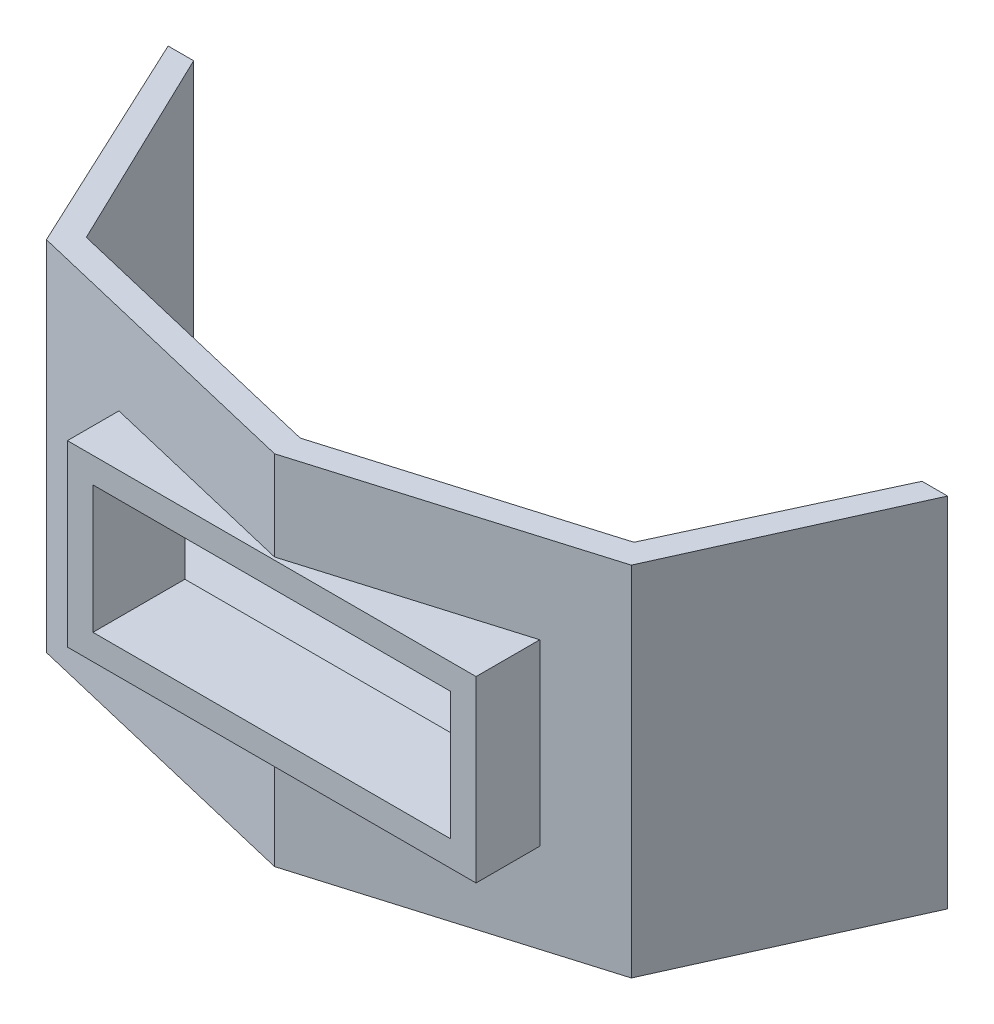
ISO-10303-21;
HEADER;
FILE_DESCRIPTION(('STEP AP214'),'2;1');
FILE_NAME('part.step','',(''),(''),'','','');
FILE_SCHEMA(('AUTOMOTIVE_DESIGN { 1 0 10303 214 1 1 1 1 }'));
ENDSEC;
DATA;
#1=APPLICATION_CONTEXT('core data for automotive mechanical design processes');
#2=APPLICATION_PROTOCOL_DEFINITION('international standard','automotive_design',2000,#1);
#3=PRODUCT_CONTEXT('',#1,'mechanical');
#4=PRODUCT('Part','Part','',(#3));
#5=PRODUCT_RELATED_PRODUCT_CATEGORY('part','',(#4));
#6=PRODUCT_DEFINITION_FORMATION('','',#4);
#7=PRODUCT_DEFINITION_CONTEXT('part definition',#1,'design');
#8=PRODUCT_DEFINITION('design','',#6,#7);
#9=PRODUCT_DEFINITION_SHAPE('','',#8);
#10=(LENGTH_UNIT() NAMED_UNIT(*) SI_UNIT(.MILLI.,.METRE.));
#11=(NAMED_UNIT(*) PLANE_ANGLE_UNIT() SI_UNIT($,.RADIAN.));
#12=(NAMED_UNIT(*) SI_UNIT($,.STERADIAN.) SOLID_ANGLE_UNIT());
#13=UNCERTAINTY_MEASURE_WITH_UNIT(LENGTH_MEASURE(1.E-05),#10,'distance_accuracy_value','');
#14=(GEOMETRIC_REPRESENTATION_CONTEXT(3) GLOBAL_UNCERTAINTY_ASSIGNED_CONTEXT((#13)) GLOBAL_UNIT_ASSIGNED_CONTEXT((#10,
#11,#12)) REPRESENTATION_CONTEXT('',''));
#15=CARTESIAN_POINT('',(0.,0.,0.));
#16=DIRECTION('',(0.,0.,1.));
#17=DIRECTION('',(1.,0.,0.));
#18=AXIS2_PLACEMENT_3D('',#15,#16,#17);
#19=CARTESIAN_POINT('',(-76.3,70.,57.7350269189626));
#20=DIRECTION('',(0.,0.,1.));
#21=DIRECTION('',(1.,0.,0.));
#22=AXIS2_PLACEMENT_3D('',#19,#20,#21);
#23=PLANE('',#22);
#24=DIRECTION('',(-1.,0.,0.));
#25=VECTOR('',#24,1.);
#26=CARTESIAN_POINT('',(-76.3,70.,57.7350269189626));
#27=LINE('',#26,#25);
#28=CARTESIAN_POINT('',(-71.3,70.,57.7350269189626));
#29=VERTEX_POINT('',#28);
#30=CARTESIAN_POINT('',(-76.3,70.,57.7350269189626));
#31=VERTEX_POINT('',#30);
#32=EDGE_CURVE('E340',#29,#31,#27,.T.);
#33=ORIENTED_EDGE('',*,*,#32,.F.);
#34=DIRECTION('',(0.,1.,0.));
#35=VECTOR('',#34,1.);
#36=CARTESIAN_POINT('',(-71.3,5.,57.7350269189626));
#37=LINE('',#36,#35);
#38=CARTESIAN_POINT('',(-71.3,5.,57.7350269189626));
#39=VERTEX_POINT('',#38);
#40=EDGE_CURVE('E322',#39,#29,#37,.T.);
#41=ORIENTED_EDGE('',*,*,#40,.F.);
#42=DIRECTION('',(-1.,0.,0.));
#43=VECTOR('',#42,1.);
#44=CARTESIAN_POINT('',(-71.3,5.,57.7350269189626));
#45=LINE('',#44,#43);
#46=CARTESIAN_POINT('',(71.3,5.,57.7350269189626));
#47=VERTEX_POINT('',#46);
#48=EDGE_CURVE('E310',#47,#39,#45,.T.);
#49=ORIENTED_EDGE('',*,*,#48,.F.);
#50=DIRECTION('',(0.,1.,0.));
#51=VECTOR('',#50,1.);
#52=CARTESIAN_POINT('',(71.3,5.,57.7350269189626));
#53=LINE('',#52,#51);
#54=CARTESIAN_POINT('',(71.3,70.,57.7350269189626));
#55=VERTEX_POINT('',#54);
#56=EDGE_CURVE('E325',#47,#55,#53,.T.);
#57=ORIENTED_EDGE('',*,*,#56,.T.);
#58=CARTESIAN_POINT('',(76.3,70.,57.7350269189626));
#59=VERTEX_POINT('',#58);
#60=EDGE_CURVE('E336',#59,#55,#27,.T.);
#61=ORIENTED_EDGE('',*,*,#60,.F.);
#62=DIRECTION('',(0.,-1.,0.));
#63=VECTOR('',#62,1.);
#64=CARTESIAN_POINT('',(76.3,70.,57.7350269189626));
#65=LINE('',#64,#63);
#66=CARTESIAN_POINT('',(76.3,0.,57.7350269189626));
#67=VERTEX_POINT('',#66);
#68=EDGE_CURVE('E348',#59,#67,#65,.T.);
#69=ORIENTED_EDGE('',*,*,#68,.T.);
#70=DIRECTION('',(-1.,0.,0.));
#71=VECTOR('',#70,1.);
#72=CARTESIAN_POINT('',(-76.3,0.,57.7350269189626));
#73=LINE('',#72,#71);
#74=CARTESIAN_POINT('',(-76.3,0.,57.7350269189626));
#75=VERTEX_POINT('',#74);
#76=EDGE_CURVE('E324',#67,#75,#73,.T.);
#77=ORIENTED_EDGE('',*,*,#76,.T.);
#78=DIRECTION('',(0.,-1.,0.));
#79=VECTOR('',#78,1.);
#80=CARTESIAN_POINT('',(-76.3,70.,57.7350269189626));
#81=LINE('',#80,#79);
#82=EDGE_CURVE('E372',#31,#75,#81,.T.);
#83=ORIENTED_EDGE('',*,*,#82,.F.);
#84=EDGE_LOOP('',(#33,#41,#49,#57,#61,#69,#77,#83));
#85=FACE_BOUND('',#84,.T.);
#86=ADVANCED_FACE('F37',(#85),#23,.F.);
#87=CARTESIAN_POINT('',(-55.3740303304235,70.,102.482648944706));
#88=DIRECTION('',(0.905843488046065,0.,-0.423612529517882));
#89=DIRECTION('',(-0.423612529517882,0.,-0.905843488046065));
#90=AXIS2_PLACEMENT_3D('',#87,#88,#89);
#91=PLANE('',#90);
#92=DIRECTION('',(0.423612529517882,0.,0.905843488046065));
#93=VECTOR('',#92,1.);
#94=CARTESIAN_POINT('',(-55.3740303304235,0.,102.482648944706));
#95=LINE('',#94,#93);
#96=CARTESIAN_POINT('',(-55.3740303304235,0.,102.482648944706));
#97=VERTEX_POINT('',#96);
#98=EDGE_CURVE('E351',#75,#97,#95,.T.);
#99=ORIENTED_EDGE('',*,*,#98,.T.);
#100=DIRECTION('',(0.,-1.,0.));
#101=VECTOR('',#100,1.);
#102=CARTESIAN_POINT('',(-55.3740303304235,70.,102.482648944706));
#103=LINE('',#102,#101);
#104=CARTESIAN_POINT('',(-55.3740303304235,70.,102.482648944706));
#105=VERTEX_POINT('',#104);
#106=EDGE_CURVE('E369',#105,#97,#103,.T.);
#107=ORIENTED_EDGE('',*,*,#106,.F.);
#108=DIRECTION('',(0.423612529517882,0.,0.905843488046065));
#109=VECTOR('',#108,1.);
#110=CARTESIAN_POINT('',(-55.3740303304235,70.,102.482648944706));
#111=LINE('',#110,#109);
#112=EDGE_CURVE('E339',#31,#105,#111,.T.);
#113=ORIENTED_EDGE('',*,*,#112,.F.);
#114=ORIENTED_EDGE('',*,*,#82,.T.);
#115=EDGE_LOOP('',(#99,#107,#113,#114));
#116=FACE_BOUND('',#115,.T.);
#117=ADVANCED_FACE('F425',(#116),#91,.F.);
#118=CARTESIAN_POINT('',(-55.3740303304235,70.,102.482648944706));
#119=DIRECTION('',(0.231748268351548,0.,-0.972775791288033));
#120=DIRECTION('',(-0.972775791288033,0.,-0.231748268351548));
#121=AXIS2_PLACEMENT_3D('',#118,#119,#120);
#122=PLANE('',#121);
#123=DIRECTION('',(0.,-1.,0.));
#124=VECTOR('',#123,1.);
#125=CARTESIAN_POINT('',(3.25268607798043,70.,116.449526131067));
#126=LINE('',#125,#124);
#127=CARTESIAN_POINT('',(3.25268607798043,17.5,116.449526131067));
#128=VERTEX_POINT('',#127);
#129=CARTESIAN_POINT('',(3.25268607798043,0.,116.449526131067));
#130=VERTEX_POINT('',#129);
#131=EDGE_CURVE('E365',#128,#130,#126,.T.);
#132=ORIENTED_EDGE('',*,*,#131,.F.);
#133=DIRECTION('',(-0.972775791288033,0.,-0.231748268351548));
#134=VECTOR('',#133,1.);
#135=CARTESIAN_POINT('',(-55.3740303304235,17.5,102.482648944706));
#136=LINE('',#135,#134);
#137=CARTESIAN_POINT('',(-36.7473139220196,17.5,106.920166110925));
#138=VERTEX_POINT('',#137);
#139=EDGE_CURVE('E290',#128,#138,#136,.T.);
#140=ORIENTED_EDGE('',*,*,#139,.T.);
#141=DIRECTION('',(0.,1.,0.));
#142=VECTOR('',#141,1.);
#143=CARTESIAN_POINT('',(-36.7473139220196,70.,106.920166110925));
#144=LINE('',#143,#142);
#145=CARTESIAN_POINT('',(-36.7473139220196,52.5,106.920166110925));
#146=VERTEX_POINT('',#145);
#147=EDGE_CURVE('E281',#138,#146,#144,.T.);
#148=ORIENTED_EDGE('',*,*,#147,.T.);
#149=DIRECTION('',(0.972775791288033,0.,0.231748268351548));
#150=VECTOR('',#149,1.);
#151=CARTESIAN_POINT('',(-55.3740303304235,52.5,102.482648944706));
#152=LINE('',#151,#150);
#153=CARTESIAN_POINT('',(3.25268607798043,52.5,116.449526131067));
#154=VERTEX_POINT('',#153);
#155=EDGE_CURVE('E278',#146,#154,#152,.T.);
#156=ORIENTED_EDGE('',*,*,#155,.T.);
#157=CARTESIAN_POINT('',(3.25268607798043,70.,116.449526131067));
#158=VERTEX_POINT('',#157);
#159=EDGE_CURVE('E366',#158,#154,#126,.T.);
#160=ORIENTED_EDGE('',*,*,#159,.F.);
#161=DIRECTION('',(0.972775791288033,0.,0.231748268351548));
#162=VECTOR('',#161,1.);
#163=CARTESIAN_POINT('',(-55.3740303304235,70.,102.482648944706));
#164=LINE('',#163,#162);
#165=EDGE_CURVE('E342',#105,#158,#164,.T.);
#166=ORIENTED_EDGE('',*,*,#165,.F.);
#167=ORIENTED_EDGE('',*,*,#106,.T.);
#168=DIRECTION('',(0.972775791288033,0.,0.231748268351548));
#169=VECTOR('',#168,1.);
#170=CARTESIAN_POINT('',(-55.3740303304235,0.,102.482648944706));
#171=LINE('',#170,#169);
#172=EDGE_CURVE('E353',#97,#130,#171,.T.);
#173=ORIENTED_EDGE('',*,*,#172,.T.);
#174=EDGE_LOOP('',(#132,#140,#148,#156,#160,#166,#167,#173));
#175=FACE_BOUND('',#174,.T.);
#176=ADVANCED_FACE('F430',(#175),#122,.F.);
#177=CARTESIAN_POINT('',(3.25268607798043,70.,116.449526131067));
#178=DIRECTION('',(-0.285688007968523,0.,-0.95832268161772));
#179=DIRECTION('',(-0.95832268161772,0.,0.285688007968523));
#180=AXIS2_PLACEMENT_3D('',#177,#178,#179);
#181=PLANE('',#180);
#182=DIRECTION('',(0.,-1.,0.));
#183=VECTOR('',#182,1.);
#184=CARTESIAN_POINT('',(43.2526860779804,70.,104.525024563964));
#185=LINE('',#184,#183);
#186=CARTESIAN_POINT('',(43.2526860779804,52.5,104.525024563964));
#187=VERTEX_POINT('',#186);
#188=CARTESIAN_POINT('',(43.2526860779805,17.5,104.525024563964));
#189=VERTEX_POINT('',#188);
#190=EDGE_CURVE('E293',#187,#189,#185,.T.);
#191=ORIENTED_EDGE('',*,*,#190,.T.);
#192=DIRECTION('',(-0.95832268161772,0.,0.285688007968523));
#193=VECTOR('',#192,1.);
#194=CARTESIAN_POINT('',(3.25268607798043,17.5,116.449526131067));
#195=LINE('',#194,#193);
#196=EDGE_CURVE('E287',#189,#128,#195,.T.);
#197=ORIENTED_EDGE('',*,*,#196,.T.);
#198=ORIENTED_EDGE('',*,*,#131,.T.);
#199=DIRECTION('',(0.958322681617719,0.,-0.285688007968523));
#200=VECTOR('',#199,1.);
#201=CARTESIAN_POINT('',(3.25268607798043,0.,116.449526131067));
#202=LINE('',#201,#200);
#203=CARTESIAN_POINT('',(57.0602122971787,0.,100.408827862998));
#204=VERTEX_POINT('',#203);
#205=EDGE_CURVE('E356',#130,#204,#202,.T.);
#206=ORIENTED_EDGE('',*,*,#205,.T.);
#207=DIRECTION('',(0.,-1.,0.));
#208=VECTOR('',#207,1.);
#209=CARTESIAN_POINT('',(57.0602122971787,70.,100.408827862998));
#210=LINE('',#209,#208);
#211=CARTESIAN_POINT('',(57.0602122971787,70.,100.408827862998));
#212=VERTEX_POINT('',#211);
#213=EDGE_CURVE('E362',#212,#204,#210,.T.);
#214=ORIENTED_EDGE('',*,*,#213,.F.);
#215=DIRECTION('',(0.958322681617719,0.,-0.285688007968523));
#216=VECTOR('',#215,1.);
#217=CARTESIAN_POINT('',(3.25268607798043,70.,116.449526131067));
#218=LINE('',#217,#216);
#219=EDGE_CURVE('E344',#158,#212,#218,.T.);
#220=ORIENTED_EDGE('',*,*,#219,.F.);
#221=ORIENTED_EDGE('',*,*,#159,.T.);
#222=DIRECTION('',(0.95832268161772,0.,-0.285688007968523));
#223=VECTOR('',#222,1.);
#224=CARTESIAN_POINT('',(3.25268607798043,52.5,116.449526131067));
#225=LINE('',#224,#223);
#226=EDGE_CURVE('E275',#154,#187,#225,.T.);
#227=ORIENTED_EDGE('',*,*,#226,.T.);
#228=EDGE_LOOP('',(#191,#197,#198,#206,#214,#220,#221,#227));
#229=FACE_BOUND('',#228,.T.);
#230=ADVANCED_FACE('F447',(#229),#181,.F.);
#231=CARTESIAN_POINT('',(57.0602122971787,70.,100.408827862998));
#232=DIRECTION('',(-0.911628861418138,0.,-0.411014378129853));
#233=DIRECTION('',(-0.411014378129853,0.,0.911628861418138));
#234=AXIS2_PLACEMENT_3D('',#231,#232,#233);
#235=PLANE('',#234);
#236=DIRECTION('',(0.411014378129853,0.,-0.911628861418138));
#237=VECTOR('',#236,1.);
#238=CARTESIAN_POINT('',(57.0602122971787,0.,100.408827862998));
#239=LINE('',#238,#237);
#240=EDGE_CURVE('E358',#204,#67,#239,.T.);
#241=ORIENTED_EDGE('',*,*,#240,.T.);
#242=ORIENTED_EDGE('',*,*,#68,.F.);
#243=DIRECTION('',(0.411014378129853,0.,-0.911628861418138));
#244=VECTOR('',#243,1.);
#245=CARTESIAN_POINT('',(57.0602122971787,70.,100.408827862998));
#246=LINE('',#245,#244);
#247=EDGE_CURVE('E346',#212,#59,#246,.T.);
#248=ORIENTED_EDGE('',*,*,#247,.F.);
#249=ORIENTED_EDGE('',*,*,#213,.T.);
#250=EDGE_LOOP('',(#241,#242,#248,#249));
#251=FACE_BOUND('',#250,.T.);
#252=ADVANCED_FACE('F451',(#251),#235,.F.);
#253=CARTESIAN_POINT('',(0.,70.,0.));
#254=DIRECTION('',(0.,1.,0.));
#255=DIRECTION('',(0.,0.,1.));
#256=AXIS2_PLACEMENT_3D('',#253,#254,#255);
#257=PLANE('',#256);
#258=DIRECTION('',(0.433093550106812,0.,0.901348976177306));
#259=VECTOR('',#258,1.);
#260=CARTESIAN_POINT('',(-51.8672905810189,70.,98.1781430420955));
#261=LINE('',#260,#259);
#262=CARTESIAN_POINT('',(-51.8672905810189,70.,98.1781430420955));
#263=VERTEX_POINT('',#262);
#264=EDGE_CURVE('E296',#29,#263,#261,.T.);
#265=ORIENTED_EDGE('',*,*,#264,.F.);
#266=ORIENTED_EDGE('',*,*,#32,.T.);
#267=ORIENTED_EDGE('',*,*,#112,.T.);
#268=ORIENTED_EDGE('',*,*,#165,.T.);
#269=ORIENTED_EDGE('',*,*,#219,.T.);
#270=ORIENTED_EDGE('',*,*,#247,.T.);
#271=ORIENTED_EDGE('',*,*,#60,.T.);
#272=DIRECTION('',(0.42047619198709,0.,-0.907303572114668));
#273=VECTOR('',#272,1.);
#274=CARTESIAN_POINT('',(53.4414666896094,70.,96.2701720092788));
#275=LINE('',#274,#273);
#276=CARTESIAN_POINT('',(53.4414666896094,70.,96.2701720092788));
#277=VERTEX_POINT('',#276);
#278=EDGE_CURVE('E301',#277,#55,#275,.T.);
#279=ORIENTED_EDGE('',*,*,#278,.F.);
#280=DIRECTION('',(0.958322681617719,0.,-0.285688007968523));
#281=VECTOR('',#280,1.);
#282=CARTESIAN_POINT('',(3.10815498127732,70.,111.275163367866));
#283=LINE('',#282,#281);
#284=CARTESIAN_POINT('',(3.10815498127732,70.,111.275163367866));
#285=VERTEX_POINT('',#284);
#286=EDGE_CURVE('E318',#285,#277,#283,.T.);
#287=ORIENTED_EDGE('',*,*,#286,.F.);
#288=DIRECTION('',(0.972775791288033,0.,0.231748268351548));
#289=VECTOR('',#288,1.);
#290=CARTESIAN_POINT('',(-51.8672905810189,70.,98.1781430420955));
#291=LINE('',#290,#289);
#292=EDGE_CURVE('E315',#263,#285,#291,.T.);
#293=ORIENTED_EDGE('',*,*,#292,.F.);
#294=EDGE_LOOP('',(#265,#266,#267,#268,#269,#270,#271,#279,#287,#293));
#295=FACE_BOUND('',#294,.T.);
#296=ADVANCED_FACE('F398',(#295),#257,.T.);
#297=CARTESIAN_POINT('',(0.,0.,0.));
#298=DIRECTION('',(0.,1.,0.));
#299=DIRECTION('',(0.,0.,1.));
#300=AXIS2_PLACEMENT_3D('',#297,#298,#299);
#301=PLANE('',#300);
#302=ORIENTED_EDGE('',*,*,#76,.F.);
#303=ORIENTED_EDGE('',*,*,#240,.F.);
#304=ORIENTED_EDGE('',*,*,#205,.F.);
#305=ORIENTED_EDGE('',*,*,#172,.F.);
#306=ORIENTED_EDGE('',*,*,#98,.F.);
#307=EDGE_LOOP('',(#302,#303,#304,#305,#306));
#308=FACE_BOUND('',#307,.T.);
#309=ADVANCED_FACE('F464',(#308),#301,.F.);
#310=CARTESIAN_POINT('',(-51.8672905810189,5.,98.1781430420955));
#311=DIRECTION('',(-0.901348976177306,0.,0.433093550106812));
#312=DIRECTION('',(0.433093550106812,0.,0.901348976177306));
#313=AXIS2_PLACEMENT_3D('',#310,#311,#312);
#314=PLANE('',#313);
#315=ORIENTED_EDGE('',*,*,#264,.T.);
#316=DIRECTION('',(0.,1.,0.));
#317=VECTOR('',#316,1.);
#318=CARTESIAN_POINT('',(-51.8672905810189,5.,98.1781430420955));
#319=LINE('',#318,#317);
#320=CARTESIAN_POINT('',(-51.8672905810189,5.,98.1781430420955));
#321=VERTEX_POINT('',#320);
#322=EDGE_CURVE('E313',#321,#263,#319,.T.);
#323=ORIENTED_EDGE('',*,*,#322,.F.);
#324=DIRECTION('',(0.433093550106812,0.,0.901348976177306));
#325=VECTOR('',#324,1.);
#326=CARTESIAN_POINT('',(-51.8672905810189,5.,98.1781430420955));
#327=LINE('',#326,#325);
#328=EDGE_CURVE('E297',#39,#321,#327,.T.);
#329=ORIENTED_EDGE('',*,*,#328,.F.);
#330=ORIENTED_EDGE('',*,*,#40,.T.);
#331=EDGE_LOOP('',(#315,#323,#329,#330));
#332=FACE_BOUND('',#331,.T.);
#333=ADVANCED_FACE('F457',(#332),#314,.F.);
#334=CARTESIAN_POINT('',(53.4414666896094,5.,96.2701720092788));
#335=DIRECTION('',(0.907303572114667,0.,0.42047619198709));
#336=DIRECTION('',(0.42047619198709,0.,-0.907303572114668));
#337=AXIS2_PLACEMENT_3D('',#334,#335,#336);
#338=PLANE('',#337);
#339=ORIENTED_EDGE('',*,*,#278,.T.);
#340=ORIENTED_EDGE('',*,*,#56,.F.);
#341=DIRECTION('',(0.42047619198709,0.,-0.907303572114668));
#342=VECTOR('',#341,1.);
#343=CARTESIAN_POINT('',(53.4414666896094,5.,96.2701720092788));
#344=LINE('',#343,#342);
#345=CARTESIAN_POINT('',(53.4414666896094,5.,96.2701720092788));
#346=VERTEX_POINT('',#345);
#347=EDGE_CURVE('E307',#346,#47,#344,.T.);
#348=ORIENTED_EDGE('',*,*,#347,.F.);
#349=DIRECTION('',(0.,1.,0.));
#350=VECTOR('',#349,1.);
#351=CARTESIAN_POINT('',(53.4414666896094,5.,96.2701720092788));
#352=LINE('',#351,#350);
#353=EDGE_CURVE('E328',#346,#277,#352,.T.);
#354=ORIENTED_EDGE('',*,*,#353,.T.);
#355=EDGE_LOOP('',(#339,#340,#348,#354));
#356=FACE_BOUND('',#355,.T.);
#357=ADVANCED_FACE('F455',(#356),#338,.F.);
#358=CARTESIAN_POINT('',(3.10815498127732,5.,111.275163367866));
#359=DIRECTION('',(0.285688007968523,0.,0.958322681617719));
#360=DIRECTION('',(0.958322681617719,0.,-0.285688007968523));
#361=AXIS2_PLACEMENT_3D('',#358,#359,#360);
#362=PLANE('',#361);
#363=DIRECTION('',(0.,1.,0.));
#364=VECTOR('',#363,1.);
#365=CARTESIAN_POINT('',(3.10815498127732,5.,111.275163367866));
#366=LINE('',#365,#364);
#367=CARTESIAN_POINT('',(3.10815498127732,5.,111.275163367866));
#368=VERTEX_POINT('',#367);
#369=CARTESIAN_POINT('',(3.10815498127733,17.5,111.275163367866));
#370=VERTEX_POINT('',#369);
#371=EDGE_CURVE('E330',#368,#370,#366,.T.);
#372=ORIENTED_EDGE('',*,*,#371,.T.);
#373=DIRECTION('',(0.958322681617719,0.,-0.285688007968523));
#374=VECTOR('',#373,1.);
#375=CARTESIAN_POINT('',(3.10815498127732,17.5,111.275163367866));
#376=LINE('',#375,#374);
#377=CARTESIAN_POINT('',(43.2526860779804,17.5,99.3075752685347));
#378=VERTEX_POINT('',#377);
#379=EDGE_CURVE('E284',#370,#378,#376,.T.);
#380=ORIENTED_EDGE('',*,*,#379,.T.);
#381=DIRECTION('',(0.,1.,0.));
#382=VECTOR('',#381,1.);
#383=CARTESIAN_POINT('',(43.2526860779804,5.00000000000001,99.3075752685347));
#384=LINE('',#383,#382);
#385=CARTESIAN_POINT('',(43.2526860779804,52.5,99.3075752685347));
#386=VERTEX_POINT('',#385);
#387=EDGE_CURVE('E11',#378,#386,#384,.T.);
#388=ORIENTED_EDGE('',*,*,#387,.T.);
#389=DIRECTION('',(-0.958322681617719,0.,0.285688007968523));
#390=VECTOR('',#389,1.);
#391=CARTESIAN_POINT('',(3.10815498127732,52.5,111.275163367866));
#392=LINE('',#391,#390);
#393=CARTESIAN_POINT('',(3.10815498127733,52.5,111.275163367866));
#394=VERTEX_POINT('',#393);
#395=EDGE_CURVE('E261',#386,#394,#392,.T.);
#396=ORIENTED_EDGE('',*,*,#395,.T.);
#397=EDGE_CURVE('E333',#394,#285,#366,.T.);
#398=ORIENTED_EDGE('',*,*,#397,.T.);
#399=ORIENTED_EDGE('',*,*,#286,.T.);
#400=ORIENTED_EDGE('',*,*,#353,.F.);
#401=DIRECTION('',(0.958322681617719,0.,-0.285688007968523));
#402=VECTOR('',#401,1.);
#403=CARTESIAN_POINT('',(3.10815498127732,5.,111.275163367866));
#404=LINE('',#403,#402);
#405=EDGE_CURVE('E304',#368,#346,#404,.T.);
#406=ORIENTED_EDGE('',*,*,#405,.F.);
#407=EDGE_LOOP('',(#372,#380,#388,#396,#398,#399,#400,#406));
#408=FACE_BOUND('',#407,.T.);
#409=ADVANCED_FACE('F388',(#408),#362,.F.);
#410=CARTESIAN_POINT('',(-51.8672905810189,5.,98.1781430420955));
#411=DIRECTION('',(-0.231748268351548,0.,0.972775791288033));
#412=DIRECTION('',(0.972775791288033,0.,0.231748268351548));
#413=AXIS2_PLACEMENT_3D('',#410,#411,#412);
#414=PLANE('',#413);
#415=DIRECTION('',(0.,-1.,0.));
#416=VECTOR('',#415,1.);
#417=CARTESIAN_POINT('',(-36.7473139220196,5.,101.780235569089));
#418=LINE('',#417,#416);
#419=CARTESIAN_POINT('',(-36.7473139220196,52.5,101.780235569089));
#420=VERTEX_POINT('',#419);
#421=CARTESIAN_POINT('',(-36.7473139220196,17.5,101.780235569089));
#422=VERTEX_POINT('',#421);
#423=EDGE_CURVE('E378',#420,#422,#418,.T.);
#424=ORIENTED_EDGE('',*,*,#423,.T.);
#425=DIRECTION('',(0.972775791288033,0.,0.231748268351548));
#426=VECTOR('',#425,1.);
#427=CARTESIAN_POINT('',(-51.8672905810189,17.5,98.1781430420955));
#428=LINE('',#427,#426);
#429=EDGE_CURVE('E44',#422,#370,#428,.T.);
#430=ORIENTED_EDGE('',*,*,#429,.T.);
#431=ORIENTED_EDGE('',*,*,#371,.F.);
#432=DIRECTION('',(0.972775791288033,0.,0.231748268351548));
#433=VECTOR('',#432,1.);
#434=CARTESIAN_POINT('',(-51.8672905810189,5.,98.1781430420955));
#435=LINE('',#434,#433);
#436=EDGE_CURVE('E300',#321,#368,#435,.T.);
#437=ORIENTED_EDGE('',*,*,#436,.F.);
#438=ORIENTED_EDGE('',*,*,#322,.T.);
#439=ORIENTED_EDGE('',*,*,#292,.T.);
#440=ORIENTED_EDGE('',*,*,#397,.F.);
#441=DIRECTION('',(-0.972775791288033,0.,-0.231748268351548));
#442=VECTOR('',#441,1.);
#443=CARTESIAN_POINT('',(-51.8672905810189,52.5,98.1781430420955));
#444=LINE('',#443,#442);
#445=EDGE_CURVE('E375',#394,#420,#444,.T.);
#446=ORIENTED_EDGE('',*,*,#445,.T.);
#447=EDGE_LOOP('',(#424,#430,#431,#437,#438,#439,#440,#446));
#448=FACE_BOUND('',#447,.T.);
#449=ADVANCED_FACE('F382',(#448),#414,.F.);
#450=CARTESIAN_POINT('',(0.,4.99999999999998,0.));
#451=DIRECTION('',(0.,-1.,0.));
#452=DIRECTION('',(0.,0.,-1.));
#453=AXIS2_PLACEMENT_3D('',#450,#451,#452);
#454=PLANE('',#453);
#455=ORIENTED_EDGE('',*,*,#328,.T.);
#456=ORIENTED_EDGE('',*,*,#436,.T.);
#457=ORIENTED_EDGE('',*,*,#405,.T.);
#458=ORIENTED_EDGE('',*,*,#347,.T.);
#459=ORIENTED_EDGE('',*,*,#48,.T.);
#460=EDGE_LOOP('',(#455,#456,#457,#458,#459));
#461=FACE_BOUND('',#460,.T.);
#462=ADVANCED_FACE('F391',(#461),#454,.F.);
#463=CARTESIAN_POINT('',(0.,0.,99.));
#464=DIRECTION('',(0.,0.,1.));
#465=DIRECTION('',(1.,0.,0.));
#466=AXIS2_PLACEMENT_3D('',#463,#464,#465);
#467=PLANE('',#466);
#468=DIRECTION('',(1.,0.,0.));
#469=VECTOR('',#468,1.);
#470=CARTESIAN_POINT('',(-31.7473139220196,22.5,99.));
#471=LINE('',#470,#469);
#472=CARTESIAN_POINT('',(-31.7473139220196,22.5,99.));
#473=VERTEX_POINT('',#472);
#474=CARTESIAN_POINT('',(38.2526860779804,22.5,99.));
#475=VERTEX_POINT('',#474);
#476=EDGE_CURVE('E205',#473,#475,#471,.T.);
#477=ORIENTED_EDGE('',*,*,#476,.T.);
#478=DIRECTION('',(0.,1.,0.));
#479=VECTOR('',#478,1.);
#480=CARTESIAN_POINT('',(38.2526860779804,47.5,99.));
#481=LINE('',#480,#479);
#482=CARTESIAN_POINT('',(38.2526860779804,47.5,99.));
#483=VERTEX_POINT('',#482);
#484=EDGE_CURVE('E199',#475,#483,#481,.T.);
#485=ORIENTED_EDGE('',*,*,#484,.T.);
#486=DIRECTION('',(-1.,0.,0.));
#487=VECTOR('',#486,1.);
#488=CARTESIAN_POINT('',(-31.7473139220196,47.5,99.));
#489=LINE('',#488,#487);
#490=CARTESIAN_POINT('',(-31.7473139220196,47.5,99.));
#491=VERTEX_POINT('',#490);
#492=EDGE_CURVE('E208',#483,#491,#489,.T.);
#493=ORIENTED_EDGE('',*,*,#492,.T.);
#494=DIRECTION('',(0.,-1.,0.));
#495=VECTOR('',#494,1.);
#496=CARTESIAN_POINT('',(-31.7473139220196,47.5,99.));
#497=LINE('',#496,#495);
#498=EDGE_CURVE('E51',#491,#473,#497,.T.);
#499=ORIENTED_EDGE('',*,*,#498,.T.);
#500=EDGE_LOOP('',(#477,#485,#493,#499));
#501=FACE_BOUND('',#500,.T.);
#502=DIRECTION('',(0.,1.,0.));
#503=VECTOR('',#502,1.);
#504=CARTESIAN_POINT('',(43.2526860779804,52.5,99.));
#505=LINE('',#504,#503);
#506=CARTESIAN_POINT('',(43.2526860779804,17.5,99.));
#507=VERTEX_POINT('',#506);
#508=CARTESIAN_POINT('',(43.2526860779804,52.5,99.));
#509=VERTEX_POINT('',#508);
#510=EDGE_CURVE('E234',#507,#509,#505,.T.);
#511=ORIENTED_EDGE('',*,*,#510,.F.);
#512=DIRECTION('',(1.,0.,0.));
#513=VECTOR('',#512,1.);
#514=CARTESIAN_POINT('',(-36.7473139220196,17.5,99.));
#515=LINE('',#514,#513);
#516=CARTESIAN_POINT('',(-36.7473139220196,17.5,99.));
#517=VERTEX_POINT('',#516);
#518=EDGE_CURVE('E244',#517,#507,#515,.T.);
#519=ORIENTED_EDGE('',*,*,#518,.F.);
#520=DIRECTION('',(0.,-1.,0.));
#521=VECTOR('',#520,1.);
#522=CARTESIAN_POINT('',(-36.7473139220196,52.5,99.));
#523=LINE('',#522,#521);
#524=CARTESIAN_POINT('',(-36.7473139220196,52.5,99.));
#525=VERTEX_POINT('',#524);
#526=EDGE_CURVE('E241',#525,#517,#523,.T.);
#527=ORIENTED_EDGE('',*,*,#526,.F.);
#528=DIRECTION('',(-1.,0.,0.));
#529=VECTOR('',#528,1.);
#530=CARTESIAN_POINT('',(-36.7473139220196,52.5,99.));
#531=LINE('',#530,#529);
#532=EDGE_CURVE('E237',#509,#525,#531,.T.);
#533=ORIENTED_EDGE('',*,*,#532,.F.);
#534=EDGE_LOOP('',(#511,#519,#527,#533));
#535=FACE_BOUND('',#534,.T.);
#536=ADVANCED_FACE('F212',(#501,#535),#467,.F.);
#537=CARTESIAN_POINT('',(-36.7473139220196,52.5,99.));
#538=DIRECTION('',(0.,1.,0.));
#539=DIRECTION('',(0.,0.,1.));
#540=AXIS2_PLACEMENT_3D('',#537,#538,#539);
#541=PLANE('',#540);
#542=ORIENTED_EDGE('',*,*,#395,.F.);
#543=DIRECTION('',(0.,0.,1.));
#544=VECTOR('',#543,1.);
#545=CARTESIAN_POINT('',(43.2526860779804,52.5,99.));
#546=LINE('',#545,#544);
#547=EDGE_CURVE('E270',#509,#386,#546,.T.);
#548=ORIENTED_EDGE('',*,*,#547,.F.);
#549=ORIENTED_EDGE('',*,*,#532,.T.);
#550=DIRECTION('',(0.,0.,1.));
#551=VECTOR('',#550,1.);
#552=CARTESIAN_POINT('',(-36.7473139220196,52.5,99.));
#553=LINE('',#552,#551);
#554=EDGE_CURVE('E267',#525,#420,#553,.T.);
#555=ORIENTED_EDGE('',*,*,#554,.T.);
#556=ORIENTED_EDGE('',*,*,#445,.F.);
#557=EDGE_LOOP('',(#542,#548,#549,#555,#556));
#558=FACE_BOUND('',#557,.T.);
#559=ADVANCED_FACE('F402',(#558),#541,.T.);
#560=CARTESIAN_POINT('',(-36.7473139220196,52.5,99.));
#561=DIRECTION('',(-1.,0.,0.));
#562=DIRECTION('',(0.,0.,1.));
#563=AXIS2_PLACEMENT_3D('',#560,#561,#562);
#564=PLANE('',#563);
#565=ORIENTED_EDGE('',*,*,#423,.F.);
#566=ORIENTED_EDGE('',*,*,#554,.F.);
#567=ORIENTED_EDGE('',*,*,#526,.T.);
#568=DIRECTION('',(0.,0.,1.));
#569=VECTOR('',#568,1.);
#570=CARTESIAN_POINT('',(-36.7473139220196,17.5,99.));
#571=LINE('',#570,#569);
#572=EDGE_CURVE('E263',#517,#422,#571,.T.);
#573=ORIENTED_EDGE('',*,*,#572,.T.);
#574=EDGE_LOOP('',(#565,#566,#567,#573));
#575=FACE_BOUND('',#574,.T.);
#576=ADVANCED_FACE('F406',(#575),#564,.T.);
#577=CARTESIAN_POINT('',(-36.7473139220196,17.5,99.));
#578=DIRECTION('',(0.,-1.,0.));
#579=DIRECTION('',(0.,0.,-1.));
#580=AXIS2_PLACEMENT_3D('',#577,#578,#579);
#581=PLANE('',#580);
#582=ORIENTED_EDGE('',*,*,#379,.F.);
#583=ORIENTED_EDGE('',*,*,#429,.F.);
#584=ORIENTED_EDGE('',*,*,#572,.F.);
#585=ORIENTED_EDGE('',*,*,#518,.T.);
#586=DIRECTION('',(0.,0.,1.));
#587=VECTOR('',#586,1.);
#588=CARTESIAN_POINT('',(43.2526860779804,17.5,99.));
#589=LINE('',#588,#587);
#590=EDGE_CURVE('E258',#507,#378,#589,.T.);
#591=ORIENTED_EDGE('',*,*,#590,.T.);
#592=EDGE_LOOP('',(#582,#583,#584,#585,#591));
#593=FACE_BOUND('',#592,.T.);
#594=ADVANCED_FACE('F408',(#593),#581,.T.);
#595=CARTESIAN_POINT('',(43.2526860779804,52.5,99.));
#596=DIRECTION('',(1.,0.,0.));
#597=DIRECTION('',(0.,1.,0.));
#598=AXIS2_PLACEMENT_3D('',#595,#596,#597);
#599=PLANE('',#598);
#600=ORIENTED_EDGE('',*,*,#387,.F.);
#601=ORIENTED_EDGE('',*,*,#590,.F.);
#602=ORIENTED_EDGE('',*,*,#510,.T.);
#603=ORIENTED_EDGE('',*,*,#547,.T.);
#604=EDGE_LOOP('',(#600,#601,#602,#603));
#605=FACE_BOUND('',#604,.T.);
#606=ADVANCED_FACE('F411',(#605),#599,.T.);
#607=ORIENTED_EDGE('',*,*,#190,.F.);
#608=CARTESIAN_POINT('',(43.2526860779804,52.5,117.));
#609=VERTEX_POINT('',#608);
#610=EDGE_CURVE('E247',#187,#609,#546,.T.);
#611=ORIENTED_EDGE('',*,*,#610,.T.);
#612=DIRECTION('',(0.,1.,0.));
#613=VECTOR('',#612,1.);
#614=CARTESIAN_POINT('',(43.2526860779804,52.5,117.));
#615=LINE('',#614,#613);
#616=CARTESIAN_POINT('',(43.2526860779804,17.5,117.));
#617=VERTEX_POINT('',#616);
#618=EDGE_CURVE('E230',#617,#609,#615,.T.);
#619=ORIENTED_EDGE('',*,*,#618,.F.);
#620=EDGE_CURVE('E262',#189,#617,#589,.T.);
#621=ORIENTED_EDGE('',*,*,#620,.F.);
#622=EDGE_LOOP('',(#607,#611,#619,#621));
#623=FACE_BOUND('',#622,.T.);
#624=ADVANCED_FACE('F413',(#623),#599,.T.);
#625=ORIENTED_EDGE('',*,*,#139,.F.);
#626=ORIENTED_EDGE('',*,*,#196,.F.);
#627=ORIENTED_EDGE('',*,*,#620,.T.);
#628=DIRECTION('',(1.,0.,0.));
#629=VECTOR('',#628,1.);
#630=CARTESIAN_POINT('',(-36.7473139220196,17.5,117.));
#631=LINE('',#630,#629);
#632=CARTESIAN_POINT('',(-36.7473139220196,17.5,117.));
#633=VERTEX_POINT('',#632);
#634=EDGE_CURVE('E238',#633,#617,#631,.T.);
#635=ORIENTED_EDGE('',*,*,#634,.F.);
#636=EDGE_CURVE('E266',#138,#633,#571,.T.);
#637=ORIENTED_EDGE('',*,*,#636,.F.);
#638=EDGE_LOOP('',(#625,#626,#627,#635,#637));
#639=FACE_BOUND('',#638,.T.);
#640=ADVANCED_FACE('F419',(#639),#581,.T.);
#641=ORIENTED_EDGE('',*,*,#147,.F.);
#642=ORIENTED_EDGE('',*,*,#636,.T.);
#643=DIRECTION('',(0.,-1.,0.));
#644=VECTOR('',#643,1.);
#645=CARTESIAN_POINT('',(-36.7473139220196,52.5,117.));
#646=LINE('',#645,#644);
#647=CARTESIAN_POINT('',(-36.7473139220196,52.5,117.));
#648=VERTEX_POINT('',#647);
#649=EDGE_CURVE('E253',#648,#633,#646,.T.);
#650=ORIENTED_EDGE('',*,*,#649,.F.);
#651=EDGE_CURVE('E269',#146,#648,#553,.T.);
#652=ORIENTED_EDGE('',*,*,#651,.F.);
#653=EDGE_LOOP('',(#641,#642,#650,#652));
#654=FACE_BOUND('',#653,.T.);
#655=ADVANCED_FACE('F544',(#654),#564,.T.);
#656=ORIENTED_EDGE('',*,*,#155,.F.);
#657=ORIENTED_EDGE('',*,*,#651,.T.);
#658=DIRECTION('',(-1.,0.,0.));
#659=VECTOR('',#658,1.);
#660=CARTESIAN_POINT('',(-36.7473139220196,52.5,117.));
#661=LINE('',#660,#659);
#662=EDGE_CURVE('E250',#609,#648,#661,.T.);
#663=ORIENTED_EDGE('',*,*,#662,.F.);
#664=ORIENTED_EDGE('',*,*,#610,.F.);
#665=ORIENTED_EDGE('',*,*,#226,.F.);
#666=EDGE_LOOP('',(#656,#657,#663,#664,#665));
#667=FACE_BOUND('',#666,.T.);
#668=ADVANCED_FACE('F538',(#667),#541,.T.);
#669=CARTESIAN_POINT('',(0.,0.,117.));
#670=DIRECTION('',(0.,0.,1.));
#671=DIRECTION('',(1.,0.,0.));
#672=AXIS2_PLACEMENT_3D('',#669,#670,#671);
#673=PLANE('',#672);
#674=DIRECTION('',(0.,1.,0.));
#675=VECTOR('',#674,1.);
#676=CARTESIAN_POINT('',(38.2526860779804,47.5,117.));
#677=LINE('',#676,#675);
#678=CARTESIAN_POINT('',(38.2526860779804,22.5,117.));
#679=VERTEX_POINT('',#678);
#680=CARTESIAN_POINT('',(38.2526860779804,47.5,117.));
#681=VERTEX_POINT('',#680);
#682=EDGE_CURVE('E59',#679,#681,#677,.T.);
#683=ORIENTED_EDGE('',*,*,#682,.F.);
#684=DIRECTION('',(1.,0.,0.));
#685=VECTOR('',#684,1.);
#686=CARTESIAN_POINT('',(-31.7473139220196,22.5,117.));
#687=LINE('',#686,#685);
#688=CARTESIAN_POINT('',(-31.7473139220196,22.5,117.));
#689=VERTEX_POINT('',#688);
#690=EDGE_CURVE('E215',#689,#679,#687,.T.);
#691=ORIENTED_EDGE('',*,*,#690,.F.);
#692=DIRECTION('',(0.,-1.,0.));
#693=VECTOR('',#692,1.);
#694=CARTESIAN_POINT('',(-31.7473139220196,47.5,117.));
#695=LINE('',#694,#693);
#696=CARTESIAN_POINT('',(-31.7473139220196,47.5,117.));
#697=VERTEX_POINT('',#696);
#698=EDGE_CURVE('E218',#697,#689,#695,.T.);
#699=ORIENTED_EDGE('',*,*,#698,.F.);
#700=DIRECTION('',(-1.,0.,0.));
#701=VECTOR('',#700,1.);
#702=CARTESIAN_POINT('',(-31.7473139220196,47.5,117.));
#703=LINE('',#702,#701);
#704=EDGE_CURVE('E224',#681,#697,#703,.T.);
#705=ORIENTED_EDGE('',*,*,#704,.F.);
#706=EDGE_LOOP('',(#683,#691,#699,#705));
#707=FACE_BOUND('',#706,.T.);
#708=ORIENTED_EDGE('',*,*,#618,.T.);
#709=ORIENTED_EDGE('',*,*,#662,.T.);
#710=ORIENTED_EDGE('',*,*,#649,.T.);
#711=ORIENTED_EDGE('',*,*,#634,.T.);
#712=EDGE_LOOP('',(#708,#709,#710,#711));
#713=FACE_BOUND('',#712,.T.);
#714=ADVANCED_FACE('F587',(#707,#713),#673,.T.);
#715=CARTESIAN_POINT('',(38.2526860779804,47.5,99.));
#716=DIRECTION('',(1.,0.,0.));
#717=DIRECTION('',(0.,0.,-1.));
#718=AXIS2_PLACEMENT_3D('',#715,#716,#717);
#719=PLANE('',#718);
#720=ORIENTED_EDGE('',*,*,#682,.T.);
#721=DIRECTION('',(0.,0.,1.));
#722=VECTOR('',#721,1.);
#723=CARTESIAN_POINT('',(38.2526860779804,47.5,99.));
#724=LINE('',#723,#722);
#725=EDGE_CURVE('E195',#483,#681,#724,.T.);
#726=ORIENTED_EDGE('',*,*,#725,.F.);
#727=ORIENTED_EDGE('',*,*,#484,.F.);
#728=DIRECTION('',(0.,0.,1.));
#729=VECTOR('',#728,1.);
#730=CARTESIAN_POINT('',(38.2526860779804,22.5,99.));
#731=LINE('',#730,#729);
#732=EDGE_CURVE('E228',#475,#679,#731,.T.);
#733=ORIENTED_EDGE('',*,*,#732,.T.);
#734=EDGE_LOOP('',(#720,#726,#727,#733));
#735=FACE_BOUND('',#734,.T.);
#736=ADVANCED_FACE('F197',(#735),#719,.F.);
#737=CARTESIAN_POINT('',(-31.7473139220196,22.5,99.));
#738=DIRECTION('',(0.,-1.,0.));
#739=DIRECTION('',(0.,0.,-1.));
#740=AXIS2_PLACEMENT_3D('',#737,#738,#739);
#741=PLANE('',#740);
#742=ORIENTED_EDGE('',*,*,#690,.T.);
#743=ORIENTED_EDGE('',*,*,#732,.F.);
#744=ORIENTED_EDGE('',*,*,#476,.F.);
#745=DIRECTION('',(0.,0.,1.));
#746=VECTOR('',#745,1.);
#747=CARTESIAN_POINT('',(-31.7473139220196,22.5,99.));
#748=LINE('',#747,#746);
#749=EDGE_CURVE('E231',#473,#689,#748,.T.);
#750=ORIENTED_EDGE('',*,*,#749,.T.);
#751=EDGE_LOOP('',(#742,#743,#744,#750));
#752=FACE_BOUND('',#751,.T.);
#753=ADVANCED_FACE('F603',(#752),#741,.F.);
#754=CARTESIAN_POINT('',(-31.7473139220196,47.5,99.));
#755=DIRECTION('',(-1.,0.,0.));
#756=DIRECTION('',(0.,0.,1.));
#757=AXIS2_PLACEMENT_3D('',#754,#755,#756);
#758=PLANE('',#757);
#759=ORIENTED_EDGE('',*,*,#698,.T.);
#760=ORIENTED_EDGE('',*,*,#749,.F.);
#761=ORIENTED_EDGE('',*,*,#498,.F.);
#762=DIRECTION('',(0.,0.,1.));
#763=VECTOR('',#762,1.);
#764=CARTESIAN_POINT('',(-31.7473139220196,47.5,99.));
#765=LINE('',#764,#763);
#766=EDGE_CURVE('E204',#491,#697,#765,.T.);
#767=ORIENTED_EDGE('',*,*,#766,.T.);
#768=EDGE_LOOP('',(#759,#760,#761,#767));
#769=FACE_BOUND('',#768,.T.);
#770=ADVANCED_FACE('F610',(#769),#758,.F.);
#771=CARTESIAN_POINT('',(-31.7473139220196,47.5,99.));
#772=DIRECTION('',(0.,1.,0.));
#773=DIRECTION('',(0.,0.,1.));
#774=AXIS2_PLACEMENT_3D('',#771,#772,#773);
#775=PLANE('',#774);
#776=ORIENTED_EDGE('',*,*,#704,.T.);
#777=ORIENTED_EDGE('',*,*,#766,.F.);
#778=ORIENTED_EDGE('',*,*,#492,.F.);
#779=ORIENTED_EDGE('',*,*,#725,.T.);
#780=EDGE_LOOP('',(#776,#777,#778,#779));
#781=FACE_BOUND('',#780,.T.);
#782=ADVANCED_FACE('F209',(#781),#775,.F.);
#783=CLOSED_SHELL('',(#86,#117,#176,#230,#252,#296,#309,#333,#357,#409,#449,#462,#536,#559,#576,
#594,#606,#624,#640,#655,#668,#714,#736,#753,#770,#782));
#784=MANIFOLD_SOLID_BREP('B2',#783);
#785=ADVANCED_BREP_SHAPE_REPRESENTATION('',(#18,#784),#14);
#786=SHAPE_DEFINITION_REPRESENTATION(#9,#785);
ENDSEC;
END-ISO-10303-21;
